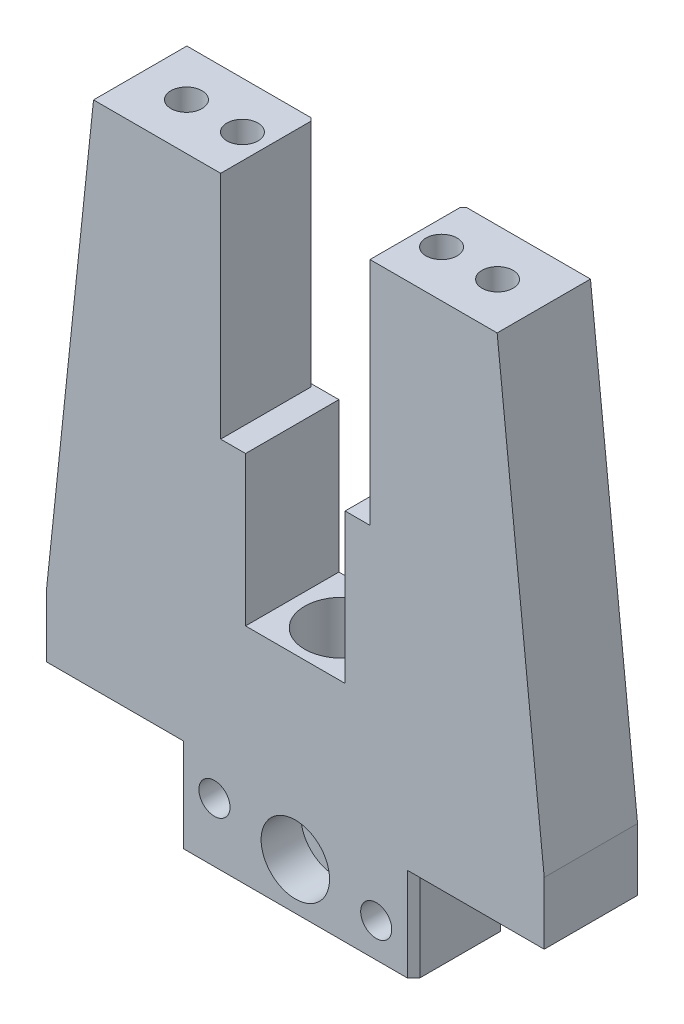
ISO-10303-21;
HEADER;
FILE_DESCRIPTION(('STEP AP214'),'2;1');
FILE_NAME('part.step','',(''),(''),'','','');
FILE_SCHEMA(('AUTOMOTIVE_DESIGN { 1 0 10303 214 1 1 1 1 }'));
ENDSEC;
DATA;
#1=APPLICATION_CONTEXT('core data for automotive mechanical design processes');
#2=APPLICATION_PROTOCOL_DEFINITION('international standard','automotive_design',2000,#1);
#3=PRODUCT_CONTEXT('',#1,'mechanical');
#4=PRODUCT('Part','Part','',(#3));
#5=PRODUCT_RELATED_PRODUCT_CATEGORY('part','',(#4));
#6=PRODUCT_DEFINITION_FORMATION('','',#4);
#7=PRODUCT_DEFINITION_CONTEXT('part definition',#1,'design');
#8=PRODUCT_DEFINITION('design','',#6,#7);
#9=PRODUCT_DEFINITION_SHAPE('','',#8);
#10=(LENGTH_UNIT() NAMED_UNIT(*) SI_UNIT(.MILLI.,.METRE.));
#11=(NAMED_UNIT(*) PLANE_ANGLE_UNIT() SI_UNIT($,.RADIAN.));
#12=(NAMED_UNIT(*) SI_UNIT($,.STERADIAN.) SOLID_ANGLE_UNIT());
#13=UNCERTAINTY_MEASURE_WITH_UNIT(LENGTH_MEASURE(1.E-05),#10,'distance_accuracy_value','');
#14=(GEOMETRIC_REPRESENTATION_CONTEXT(3) GLOBAL_UNCERTAINTY_ASSIGNED_CONTEXT((#13)) GLOBAL_UNIT_ASSIGNED_CONTEXT((#10,
#11,#12)) REPRESENTATION_CONTEXT('',''));
#15=CARTESIAN_POINT('',(0.,0.,0.));
#16=DIRECTION('',(0.,0.,1.));
#17=DIRECTION('',(1.,0.,0.));
#18=AXIS2_PLACEMENT_3D('',#15,#16,#17);
#19=CARTESIAN_POINT('',(-40.,25.,15.));
#20=DIRECTION('',(0.994521895368273,-0.104528463267654,0.));
#21=DIRECTION('',(0.104528463267654,0.994521895368273,0.));
#22=AXIS2_PLACEMENT_3D('',#19,#20,#21);
#23=PLANE('',#22);
#24=DIRECTION('',(-0.104528463267654,-0.994521895368273,0.));
#25=VECTOR('',#24,1.);
#26=CARTESIAN_POINT('',(-40.,25.,0.));
#27=LINE('',#26,#25);
#28=CARTESIAN_POINT('',(-32.4324950608713,97.,0.));
#29=VERTEX_POINT('',#28);
#30=CARTESIAN_POINT('',(-40.,25.,0.));
#31=VERTEX_POINT('',#30);
#32=EDGE_CURVE('E244',#29,#31,#27,.T.);
#33=ORIENTED_EDGE('',*,*,#32,.T.);
#34=DIRECTION('',(0.,0.,-1.));
#35=VECTOR('',#34,1.);
#36=CARTESIAN_POINT('',(-40.,25.,15.));
#37=LINE('',#36,#35);
#38=CARTESIAN_POINT('',(-40.,25.,15.));
#39=VERTEX_POINT('',#38);
#40=EDGE_CURVE('E359',#39,#31,#37,.T.);
#41=ORIENTED_EDGE('',*,*,#40,.F.);
#42=DIRECTION('',(-0.104528463267654,-0.994521895368273,0.));
#43=VECTOR('',#42,1.);
#44=CARTESIAN_POINT('',(-40.,25.,15.));
#45=LINE('',#44,#43);
#46=CARTESIAN_POINT('',(-32.4324950608713,97.,15.));
#47=VERTEX_POINT('',#46);
#48=EDGE_CURVE('E245',#47,#39,#45,.T.);
#49=ORIENTED_EDGE('',*,*,#48,.F.);
#50=DIRECTION('',(0.,0.,-1.));
#51=VECTOR('',#50,1.);
#52=CARTESIAN_POINT('',(-32.4324950608713,97.,15.));
#53=LINE('',#52,#51);
#54=EDGE_CURVE('E280',#47,#29,#53,.T.);
#55=ORIENTED_EDGE('',*,*,#54,.T.);
#56=EDGE_LOOP('',(#33,#41,#49,#55));
#57=FACE_BOUND('',#56,.T.);
#58=ADVANCED_FACE('F38',(#57),#23,.F.);
#59=CARTESIAN_POINT('',(-40.,15.,15.));
#60=DIRECTION('',(1.,0.,0.));
#61=DIRECTION('',(0.,0.,-1.));
#62=AXIS2_PLACEMENT_3D('',#59,#60,#61);
#63=PLANE('',#62);
#64=DIRECTION('',(0.,-1.,0.));
#65=VECTOR('',#64,1.);
#66=CARTESIAN_POINT('',(-40.,15.,0.));
#67=LINE('',#66,#65);
#68=CARTESIAN_POINT('',(-40.,15.,0.));
#69=VERTEX_POINT('',#68);
#70=EDGE_CURVE('E283',#31,#69,#67,.T.);
#71=ORIENTED_EDGE('',*,*,#70,.T.);
#72=DIRECTION('',(0.,0.,-1.));
#73=VECTOR('',#72,1.);
#74=CARTESIAN_POINT('',(-40.,15.,15.));
#75=LINE('',#74,#73);
#76=CARTESIAN_POINT('',(-40.,15.,15.));
#77=VERTEX_POINT('',#76);
#78=EDGE_CURVE('E356',#77,#69,#75,.T.);
#79=ORIENTED_EDGE('',*,*,#78,.F.);
#80=DIRECTION('',(0.,-1.,0.));
#81=VECTOR('',#80,1.);
#82=CARTESIAN_POINT('',(-40.,15.,15.));
#83=LINE('',#82,#81);
#84=EDGE_CURVE('E248',#39,#77,#83,.T.);
#85=ORIENTED_EDGE('',*,*,#84,.F.);
#86=ORIENTED_EDGE('',*,*,#40,.T.);
#87=EDGE_LOOP('',(#71,#79,#85,#86));
#88=FACE_BOUND('',#87,.T.);
#89=ADVANCED_FACE('F514',(#88),#63,.F.);
#90=CARTESIAN_POINT('',(-19.,15.,15.));
#91=DIRECTION('',(0.,1.,0.));
#92=DIRECTION('',(-1.,0.,0.));
#93=AXIS2_PLACEMENT_3D('',#90,#91,#92);
#94=PLANE('',#93);
#95=DIRECTION('',(1.,0.,0.));
#96=VECTOR('',#95,1.);
#97=CARTESIAN_POINT('',(-19.,15.,0.));
#98=LINE('',#97,#96);
#99=CARTESIAN_POINT('',(-18.,15.,0.));
#100=VERTEX_POINT('',#99);
#101=EDGE_CURVE('E285',#69,#100,#98,.T.);
#102=ORIENTED_EDGE('',*,*,#101,.T.);
#103=DIRECTION('',(-0.707106781186543,0.,0.707106781186552));
#104=VECTOR('',#103,1.);
#105=CARTESIAN_POINT('',(-26.,15.,8.0000000000001));
#106=LINE('',#105,#104);
#107=CARTESIAN_POINT('',(-19.,15.,1.));
#108=VERTEX_POINT('',#107);
#109=EDGE_CURVE('E394',#100,#108,#106,.T.);
#110=ORIENTED_EDGE('',*,*,#109,.T.);
#111=DIRECTION('',(0.,0.,-1.));
#112=VECTOR('',#111,1.);
#113=CARTESIAN_POINT('',(-19.,15.,15.));
#114=LINE('',#113,#112);
#115=CARTESIAN_POINT('',(-19.,15.,14.));
#116=VERTEX_POINT('',#115);
#117=EDGE_CURVE('E353',#116,#108,#114,.T.);
#118=ORIENTED_EDGE('',*,*,#117,.F.);
#119=DIRECTION('',(-0.707106781186552,0.,-0.707106781186543));
#120=VECTOR('',#119,1.);
#121=CARTESIAN_POINT('',(-18.5,15.,14.5));
#122=LINE('',#121,#120);
#123=CARTESIAN_POINT('',(-18.,15.,15.));
#124=VERTEX_POINT('',#123);
#125=EDGE_CURVE('E398',#116,#124,#122,.F.);
#126=ORIENTED_EDGE('',*,*,#125,.T.);
#127=DIRECTION('',(1.,0.,0.));
#128=VECTOR('',#127,1.);
#129=CARTESIAN_POINT('',(-19.,15.,15.));
#130=LINE('',#129,#128);
#131=EDGE_CURVE('E251',#77,#124,#130,.T.);
#132=ORIENTED_EDGE('',*,*,#131,.F.);
#133=ORIENTED_EDGE('',*,*,#78,.T.);
#134=EDGE_LOOP('',(#102,#110,#118,#126,#132,#133));
#135=FACE_BOUND('',#134,.T.);
#136=ADVANCED_FACE('F468',(#135),#94,.F.);
#137=CARTESIAN_POINT('',(-19.,0.,15.));
#138=DIRECTION('',(1.,0.,0.));
#139=DIRECTION('',(0.,0.,-1.));
#140=AXIS2_PLACEMENT_3D('',#137,#138,#139);
#141=PLANE('',#140);
#142=ORIENTED_EDGE('',*,*,#117,.T.);
#143=DIRECTION('',(0.,-1.,0.));
#144=VECTOR('',#143,1.);
#145=CARTESIAN_POINT('',(-19.,0.,1.));
#146=LINE('',#145,#144);
#147=CARTESIAN_POINT('',(-19.,0.,1.));
#148=VERTEX_POINT('',#147);
#149=EDGE_CURVE('E382',#108,#148,#146,.T.);
#150=ORIENTED_EDGE('',*,*,#149,.T.);
#151=DIRECTION('',(0.,0.,-1.));
#152=VECTOR('',#151,1.);
#153=CARTESIAN_POINT('',(-19.,0.,15.));
#154=LINE('',#153,#152);
#155=CARTESIAN_POINT('',(-19.,0.,14.));
#156=VERTEX_POINT('',#155);
#157=EDGE_CURVE('E350',#156,#148,#154,.T.);
#158=ORIENTED_EDGE('',*,*,#157,.F.);
#159=DIRECTION('',(0.,1.,0.));
#160=VECTOR('',#159,1.);
#161=CARTESIAN_POINT('',(-19.,0.,14.));
#162=LINE('',#161,#160);
#163=EDGE_CURVE('E380',#156,#116,#162,.T.);
#164=ORIENTED_EDGE('',*,*,#163,.T.);
#165=EDGE_LOOP('',(#142,#150,#158,#164));
#166=FACE_BOUND('',#165,.T.);
#167=ADVANCED_FACE('F463',(#166),#141,.F.);
#168=CARTESIAN_POINT('',(19.,0.,15.));
#169=DIRECTION('',(0.,1.,0.));
#170=DIRECTION('',(0.,0.,1.));
#171=AXIS2_PLACEMENT_3D('',#168,#169,#170);
#172=PLANE('',#171);
#173=DIRECTION('',(1.,0.,0.));
#174=VECTOR('',#173,1.);
#175=CARTESIAN_POINT('',(19.,0.,0.));
#176=LINE('',#175,#174);
#177=CARTESIAN_POINT('',(-18.,0.,0.));
#178=VERTEX_POINT('',#177);
#179=CARTESIAN_POINT('',(18.,0.,0.));
#180=VERTEX_POINT('',#179);
#181=EDGE_CURVE('E287',#178,#180,#176,.T.);
#182=ORIENTED_EDGE('',*,*,#181,.T.);
#183=DIRECTION('',(0.707106781186543,0.,0.707106781186552));
#184=VECTOR('',#183,1.);
#185=CARTESIAN_POINT('',(19.,0.,1.));
#186=LINE('',#185,#184);
#187=CARTESIAN_POINT('',(19.,0.,1.));
#188=VERTEX_POINT('',#187);
#189=EDGE_CURVE('E378',#180,#188,#186,.T.);
#190=ORIENTED_EDGE('',*,*,#189,.T.);
#191=DIRECTION('',(0.,0.,-1.));
#192=VECTOR('',#191,1.);
#193=CARTESIAN_POINT('',(19.,0.,15.));
#194=LINE('',#193,#192);
#195=CARTESIAN_POINT('',(19.,0.,14.));
#196=VERTEX_POINT('',#195);
#197=EDGE_CURVE('E347',#196,#188,#194,.T.);
#198=ORIENTED_EDGE('',*,*,#197,.F.);
#199=DIRECTION('',(0.707106781186552,0.,-0.707106781186543));
#200=VECTOR('',#199,1.);
#201=CARTESIAN_POINT('',(18.,0.,15.));
#202=LINE('',#201,#200);
#203=CARTESIAN_POINT('',(18.,0.,15.));
#204=VERTEX_POINT('',#203);
#205=EDGE_CURVE('E374',#196,#204,#202,.F.);
#206=ORIENTED_EDGE('',*,*,#205,.T.);
#207=DIRECTION('',(1.,0.,0.));
#208=VECTOR('',#207,1.);
#209=CARTESIAN_POINT('',(19.,0.,15.));
#210=LINE('',#209,#208);
#211=CARTESIAN_POINT('',(-18.,0.,15.));
#212=VERTEX_POINT('',#211);
#213=EDGE_CURVE('E253',#212,#204,#210,.T.);
#214=ORIENTED_EDGE('',*,*,#213,.F.);
#215=DIRECTION('',(0.707106781186552,0.,0.707106781186543));
#216=VECTOR('',#215,1.);
#217=CARTESIAN_POINT('',(-18.,0.,15.));
#218=LINE('',#217,#216);
#219=EDGE_CURVE('E372',#212,#156,#218,.F.);
#220=ORIENTED_EDGE('',*,*,#219,.T.);
#221=ORIENTED_EDGE('',*,*,#157,.T.);
#222=DIRECTION('',(0.707106781186543,0.,-0.707106781186552));
#223=VECTOR('',#222,1.);
#224=CARTESIAN_POINT('',(-19.,0.,1.));
#225=LINE('',#224,#223);
#226=EDGE_CURVE('E376',#148,#178,#225,.T.);
#227=ORIENTED_EDGE('',*,*,#226,.T.);
#228=EDGE_LOOP('',(#182,#190,#198,#206,#214,#220,#221,#227));
#229=FACE_BOUND('',#228,.T.);
#230=ADVANCED_FACE('F455',(#229),#172,.F.);
#231=CARTESIAN_POINT('',(19.,0.,15.));
#232=DIRECTION('',(-1.,0.,0.));
#233=DIRECTION('',(0.,0.,1.));
#234=AXIS2_PLACEMENT_3D('',#231,#232,#233);
#235=PLANE('',#234);
#236=ORIENTED_EDGE('',*,*,#197,.T.);
#237=DIRECTION('',(0.,1.,0.));
#238=VECTOR('',#237,1.);
#239=CARTESIAN_POINT('',(19.,15.,1.));
#240=LINE('',#239,#238);
#241=CARTESIAN_POINT('',(19.,15.,1.));
#242=VERTEX_POINT('',#241);
#243=EDGE_CURVE('E364',#188,#242,#240,.T.);
#244=ORIENTED_EDGE('',*,*,#243,.T.);
#245=DIRECTION('',(0.,0.,-1.));
#246=VECTOR('',#245,1.);
#247=CARTESIAN_POINT('',(19.,15.,15.));
#248=LINE('',#247,#246);
#249=CARTESIAN_POINT('',(19.,15.,14.));
#250=VERTEX_POINT('',#249);
#251=EDGE_CURVE('E344',#250,#242,#248,.T.);
#252=ORIENTED_EDGE('',*,*,#251,.F.);
#253=DIRECTION('',(0.,-1.,0.));
#254=VECTOR('',#253,1.);
#255=CARTESIAN_POINT('',(19.,0.,14.));
#256=LINE('',#255,#254);
#257=EDGE_CURVE('E362',#250,#196,#256,.T.);
#258=ORIENTED_EDGE('',*,*,#257,.T.);
#259=EDGE_LOOP('',(#236,#244,#252,#258));
#260=FACE_BOUND('',#259,.T.);
#261=ADVANCED_FACE('F640',(#260),#235,.F.);
#262=CARTESIAN_POINT('',(19.,15.,15.));
#263=DIRECTION('',(0.,1.,0.));
#264=DIRECTION('',(-1.,0.,0.));
#265=AXIS2_PLACEMENT_3D('',#262,#263,#264);
#266=PLANE('',#265);
#267=DIRECTION('',(1.,0.,0.));
#268=VECTOR('',#267,1.);
#269=CARTESIAN_POINT('',(19.,15.,0.));
#270=LINE('',#269,#268);
#271=CARTESIAN_POINT('',(18.,15.,0.));
#272=VERTEX_POINT('',#271);
#273=CARTESIAN_POINT('',(40.,15.,0.));
#274=VERTEX_POINT('',#273);
#275=EDGE_CURVE('E290',#272,#274,#270,.T.);
#276=ORIENTED_EDGE('',*,*,#275,.T.);
#277=DIRECTION('',(0.,0.,-1.));
#278=VECTOR('',#277,1.);
#279=CARTESIAN_POINT('',(40.,15.,15.));
#280=LINE('',#279,#278);
#281=CARTESIAN_POINT('',(40.,15.,15.));
#282=VERTEX_POINT('',#281);
#283=EDGE_CURVE('E341',#282,#274,#280,.T.);
#284=ORIENTED_EDGE('',*,*,#283,.F.);
#285=DIRECTION('',(1.,0.,0.));
#286=VECTOR('',#285,1.);
#287=CARTESIAN_POINT('',(19.,15.,15.));
#288=LINE('',#287,#286);
#289=CARTESIAN_POINT('',(18.,15.,15.));
#290=VERTEX_POINT('',#289);
#291=EDGE_CURVE('E256',#290,#282,#288,.T.);
#292=ORIENTED_EDGE('',*,*,#291,.F.);
#293=DIRECTION('',(-0.707106781186552,0.,0.707106781186543));
#294=VECTOR('',#293,1.);
#295=CARTESIAN_POINT('',(18.5,15.,14.5));
#296=LINE('',#295,#294);
#297=EDGE_CURVE('E396',#290,#250,#296,.F.);
#298=ORIENTED_EDGE('',*,*,#297,.T.);
#299=ORIENTED_EDGE('',*,*,#251,.T.);
#300=DIRECTION('',(-0.707106781186543,0.,-0.707106781186552));
#301=VECTOR('',#300,1.);
#302=CARTESIAN_POINT('',(26.,15.,8.0000000000001));
#303=LINE('',#302,#301);
#304=EDGE_CURVE('E391',#242,#272,#303,.T.);
#305=ORIENTED_EDGE('',*,*,#304,.T.);
#306=EDGE_LOOP('',(#276,#284,#292,#298,#299,#305));
#307=FACE_BOUND('',#306,.T.);
#308=ADVANCED_FACE('F444',(#307),#266,.F.);
#309=CARTESIAN_POINT('',(40.,15.,15.));
#310=DIRECTION('',(-1.,0.,0.));
#311=DIRECTION('',(0.,0.,1.));
#312=AXIS2_PLACEMENT_3D('',#309,#310,#311);
#313=PLANE('',#312);
#314=DIRECTION('',(0.,1.,0.));
#315=VECTOR('',#314,1.);
#316=CARTESIAN_POINT('',(40.,15.,0.));
#317=LINE('',#316,#315);
#318=CARTESIAN_POINT('',(40.,25.,0.));
#319=VERTEX_POINT('',#318);
#320=EDGE_CURVE('E292',#274,#319,#317,.T.);
#321=ORIENTED_EDGE('',*,*,#320,.T.);
#322=DIRECTION('',(0.,0.,-1.));
#323=VECTOR('',#322,1.);
#324=CARTESIAN_POINT('',(40.,25.,15.));
#325=LINE('',#324,#323);
#326=CARTESIAN_POINT('',(40.,25.,15.));
#327=VERTEX_POINT('',#326);
#328=EDGE_CURVE('E338',#327,#319,#325,.T.);
#329=ORIENTED_EDGE('',*,*,#328,.F.);
#330=DIRECTION('',(0.,1.,0.));
#331=VECTOR('',#330,1.);
#332=CARTESIAN_POINT('',(40.,15.,15.));
#333=LINE('',#332,#331);
#334=EDGE_CURVE('E258',#282,#327,#333,.T.);
#335=ORIENTED_EDGE('',*,*,#334,.F.);
#336=ORIENTED_EDGE('',*,*,#283,.T.);
#337=EDGE_LOOP('',(#321,#329,#335,#336));
#338=FACE_BOUND('',#337,.T.);
#339=ADVANCED_FACE('F440',(#338),#313,.F.);
#340=CARTESIAN_POINT('',(40.,25.,15.));
#341=DIRECTION('',(-0.994521895368273,-0.104528463267654,0.));
#342=DIRECTION('',(0.104528463267654,-0.994521895368273,0.));
#343=AXIS2_PLACEMENT_3D('',#340,#341,#342);
#344=PLANE('',#343);
#345=DIRECTION('',(-0.104528463267654,0.994521895368273,0.));
#346=VECTOR('',#345,1.);
#347=CARTESIAN_POINT('',(40.,25.,0.));
#348=LINE('',#347,#346);
#349=CARTESIAN_POINT('',(32.4324950608713,97.,0.));
#350=VERTEX_POINT('',#349);
#351=EDGE_CURVE('E294',#319,#350,#348,.T.);
#352=ORIENTED_EDGE('',*,*,#351,.T.);
#353=DIRECTION('',(0.,0.,-1.));
#354=VECTOR('',#353,1.);
#355=CARTESIAN_POINT('',(32.4324950608713,97.,15.));
#356=LINE('',#355,#354);
#357=CARTESIAN_POINT('',(32.4324950608713,97.,15.));
#358=VERTEX_POINT('',#357);
#359=EDGE_CURVE('E335',#358,#350,#356,.T.);
#360=ORIENTED_EDGE('',*,*,#359,.F.);
#361=DIRECTION('',(-0.104528463267654,0.994521895368273,0.));
#362=VECTOR('',#361,1.);
#363=CARTESIAN_POINT('',(40.,25.,15.));
#364=LINE('',#363,#362);
#365=EDGE_CURVE('E260',#327,#358,#364,.T.);
#366=ORIENTED_EDGE('',*,*,#365,.F.);
#367=ORIENTED_EDGE('',*,*,#328,.T.);
#368=EDGE_LOOP('',(#352,#360,#366,#367));
#369=FACE_BOUND('',#368,.T.);
#370=ADVANCED_FACE('F436',(#369),#344,.F.);
#371=CARTESIAN_POINT('',(32.4324950608713,97.,15.));
#372=DIRECTION('',(0.,-1.,0.));
#373=DIRECTION('',(0.,0.,-1.));
#374=AXIS2_PLACEMENT_3D('',#371,#372,#373);
#375=PLANE('',#374);
#376=CARTESIAN_POINT('',(25.,97.,7.5));
#377=DIRECTION('',(0.,1.,0.));
#378=DIRECTION('',(0.,0.,1.));
#379=AXIS2_PLACEMENT_3D('',#376,#377,#378);
#380=CIRCLE('',#379,2.5);
#381=CARTESIAN_POINT('',(25.,97.,10.));
#382=VERTEX_POINT('',#381);
#383=EDGE_CURVE('E219',#382,#382,#380,.T.);
#384=ORIENTED_EDGE('',*,*,#383,.F.);
#385=EDGE_LOOP('',(#384));
#386=FACE_BOUND('',#385,.T.);
#387=CARTESIAN_POINT('',(16.,97.,7.5));
#388=DIRECTION('',(0.,1.,0.));
#389=DIRECTION('',(0.,0.,1.));
#390=AXIS2_PLACEMENT_3D('',#387,#388,#389);
#391=CIRCLE('',#390,2.49999999999999);
#392=CARTESIAN_POINT('',(16.,97.,9.99999999999999));
#393=VERTEX_POINT('',#392);
#394=EDGE_CURVE('E238',#393,#393,#391,.T.);
#395=ORIENTED_EDGE('',*,*,#394,.F.);
#396=EDGE_LOOP('',(#395));
#397=FACE_BOUND('',#396,.T.);
#398=DIRECTION('',(-1.,0.,0.));
#399=VECTOR('',#398,1.);
#400=CARTESIAN_POINT('',(32.4324950608713,97.,0.));
#401=LINE('',#400,#399);
#402=CARTESIAN_POINT('',(12.5,97.,0.));
#403=VERTEX_POINT('',#402);
#404=EDGE_CURVE('E296',#350,#403,#401,.T.);
#405=ORIENTED_EDGE('',*,*,#404,.T.);
#406=DIRECTION('',(-0.707106781186536,0.,0.707106781186559));
#407=VECTOR('',#406,1.);
#408=CARTESIAN_POINT('',(12.,97.,0.5));
#409=LINE('',#408,#407);
#410=CARTESIAN_POINT('',(12.,97.,0.500000000000004));
#411=VERTEX_POINT('',#410);
#412=EDGE_CURVE('E409',#403,#411,#409,.T.);
#413=ORIENTED_EDGE('',*,*,#412,.T.);
#414=DIRECTION('',(0.,0.,-1.));
#415=VECTOR('',#414,1.);
#416=CARTESIAN_POINT('',(12.,97.,15.));
#417=LINE('',#416,#415);
#418=CARTESIAN_POINT('',(12.,97.,15.));
#419=VERTEX_POINT('',#418);
#420=EDGE_CURVE('E332',#419,#411,#417,.T.);
#421=ORIENTED_EDGE('',*,*,#420,.F.);
#422=DIRECTION('',(-1.,0.,0.));
#423=VECTOR('',#422,1.);
#424=CARTESIAN_POINT('',(32.4324950608713,97.,15.));
#425=LINE('',#424,#423);
#426=EDGE_CURVE('E262',#358,#419,#425,.T.);
#427=ORIENTED_EDGE('',*,*,#426,.F.);
#428=ORIENTED_EDGE('',*,*,#359,.T.);
#429=EDGE_LOOP('',(#405,#413,#421,#427,#428));
#430=FACE_BOUND('',#429,.T.);
#431=ADVANCED_FACE('F430',(#386,#397,#430),#375,.F.);
#432=CARTESIAN_POINT('',(12.,97.,15.));
#433=DIRECTION('',(1.,0.,0.));
#434=DIRECTION('',(0.,1.,0.));
#435=AXIS2_PLACEMENT_3D('',#432,#433,#434);
#436=PLANE('',#435);
#437=ORIENTED_EDGE('',*,*,#420,.T.);
#438=DIRECTION('',(0.,-1.,0.));
#439=VECTOR('',#438,1.);
#440=CARTESIAN_POINT('',(12.,60.,0.5));
#441=LINE('',#440,#439);
#442=CARTESIAN_POINT('',(12.,60.,0.5));
#443=VERTEX_POINT('',#442);
#444=EDGE_CURVE('E401',#411,#443,#441,.T.);
#445=ORIENTED_EDGE('',*,*,#444,.T.);
#446=DIRECTION('',(0.,0.,-1.));
#447=VECTOR('',#446,1.);
#448=CARTESIAN_POINT('',(12.,60.,15.));
#449=LINE('',#448,#447);
#450=CARTESIAN_POINT('',(12.,60.,15.));
#451=VERTEX_POINT('',#450);
#452=EDGE_CURVE('E329',#451,#443,#449,.T.);
#453=ORIENTED_EDGE('',*,*,#452,.F.);
#454=DIRECTION('',(0.,-1.,0.));
#455=VECTOR('',#454,1.);
#456=CARTESIAN_POINT('',(12.,97.,15.));
#457=LINE('',#456,#455);
#458=EDGE_CURVE('E264',#419,#451,#457,.T.);
#459=ORIENTED_EDGE('',*,*,#458,.F.);
#460=EDGE_LOOP('',(#437,#445,#453,#459));
#461=FACE_BOUND('',#460,.T.);
#462=ADVANCED_FACE('F483',(#461),#436,.F.);
#463=CARTESIAN_POINT('',(12.,60.,15.));
#464=DIRECTION('',(0.,-1.,0.));
#465=DIRECTION('',(0.,0.,-1.));
#466=AXIS2_PLACEMENT_3D('',#463,#464,#465);
#467=PLANE('',#466);
#468=DIRECTION('',(-1.,0.,0.));
#469=VECTOR('',#468,1.);
#470=CARTESIAN_POINT('',(12.,60.,0.));
#471=LINE('',#470,#469);
#472=CARTESIAN_POINT('',(12.5,60.,0.));
#473=VERTEX_POINT('',#472);
#474=CARTESIAN_POINT('',(8.,60.,0.));
#475=VERTEX_POINT('',#474);
#476=EDGE_CURVE('E299',#473,#475,#471,.T.);
#477=ORIENTED_EDGE('',*,*,#476,.T.);
#478=DIRECTION('',(0.,0.,-1.));
#479=VECTOR('',#478,1.);
#480=CARTESIAN_POINT('',(8.,60.,15.));
#481=LINE('',#480,#479);
#482=CARTESIAN_POINT('',(8.,60.,15.));
#483=VERTEX_POINT('',#482);
#484=EDGE_CURVE('E326',#483,#475,#481,.T.);
#485=ORIENTED_EDGE('',*,*,#484,.F.);
#486=DIRECTION('',(-1.,0.,0.));
#487=VECTOR('',#486,1.);
#488=CARTESIAN_POINT('',(12.,60.,15.));
#489=LINE('',#488,#487);
#490=EDGE_CURVE('E266',#451,#483,#489,.T.);
#491=ORIENTED_EDGE('',*,*,#490,.F.);
#492=ORIENTED_EDGE('',*,*,#452,.T.);
#493=DIRECTION('',(0.707106781186536,0.,-0.707106781186559));
#494=VECTOR('',#493,1.);
#495=CARTESIAN_POINT('',(4.75,60.,7.75000000000023));
#496=LINE('',#495,#494);
#497=EDGE_CURVE('E46',#443,#473,#496,.T.);
#498=ORIENTED_EDGE('',*,*,#497,.T.);
#499=EDGE_LOOP('',(#477,#485,#491,#492,#498));
#500=FACE_BOUND('',#499,.T.);
#501=ADVANCED_FACE('F416',(#500),#467,.F.);
#502=CARTESIAN_POINT('',(8.,60.,15.));
#503=DIRECTION('',(1.,0.,0.));
#504=DIRECTION('',(0.,1.,0.));
#505=AXIS2_PLACEMENT_3D('',#502,#503,#504);
#506=PLANE('',#505);
#507=DIRECTION('',(0.,-1.,0.));
#508=VECTOR('',#507,1.);
#509=CARTESIAN_POINT('',(8.,60.,0.));
#510=LINE('',#509,#508);
#511=CARTESIAN_POINT('',(8.,36.,0.));
#512=VERTEX_POINT('',#511);
#513=EDGE_CURVE('E301',#475,#512,#510,.T.);
#514=ORIENTED_EDGE('',*,*,#513,.T.);
#515=DIRECTION('',(0.,0.,-1.));
#516=VECTOR('',#515,1.);
#517=CARTESIAN_POINT('',(8.,36.,15.));
#518=LINE('',#517,#516);
#519=CARTESIAN_POINT('',(8.,36.,15.));
#520=VERTEX_POINT('',#519);
#521=EDGE_CURVE('E323',#520,#512,#518,.T.);
#522=ORIENTED_EDGE('',*,*,#521,.F.);
#523=DIRECTION('',(0.,-1.,0.));
#524=VECTOR('',#523,1.);
#525=CARTESIAN_POINT('',(8.,60.,15.));
#526=LINE('',#525,#524);
#527=EDGE_CURVE('E268',#483,#520,#526,.T.);
#528=ORIENTED_EDGE('',*,*,#527,.F.);
#529=ORIENTED_EDGE('',*,*,#484,.T.);
#530=EDGE_LOOP('',(#514,#522,#528,#529));
#531=FACE_BOUND('',#530,.T.);
#532=ADVANCED_FACE('F489',(#531),#506,.F.);
#533=CARTESIAN_POINT('',(-8.,36.,15.));
#534=DIRECTION('',(0.,-1.,0.));
#535=DIRECTION('',(0.,0.,-1.));
#536=AXIS2_PLACEMENT_3D('',#533,#534,#535);
#537=PLANE('',#536);
#538=CARTESIAN_POINT('',(0.,36.,7.5));
#539=DIRECTION('',(0.,1.,0.));
#540=DIRECTION('',(0.,0.,1.));
#541=AXIS2_PLACEMENT_3D('',#538,#539,#540);
#542=CIRCLE('',#541,6.);
#543=CARTESIAN_POINT('',(0.,36.,13.5));
#544=VERTEX_POINT('',#543);
#545=EDGE_CURVE('E869',#544,#544,#542,.T.);
#546=ORIENTED_EDGE('',*,*,#545,.F.);
#547=EDGE_LOOP('',(#546));
#548=FACE_BOUND('',#547,.T.);
#549=DIRECTION('',(-1.,0.,0.));
#550=VECTOR('',#549,1.);
#551=CARTESIAN_POINT('',(-8.,36.,0.));
#552=LINE('',#551,#550);
#553=CARTESIAN_POINT('',(-8.,36.,0.));
#554=VERTEX_POINT('',#553);
#555=EDGE_CURVE('E303',#512,#554,#552,.T.);
#556=ORIENTED_EDGE('',*,*,#555,.T.);
#557=DIRECTION('',(0.,0.,-1.));
#558=VECTOR('',#557,1.);
#559=CARTESIAN_POINT('',(-8.,36.,15.));
#560=LINE('',#559,#558);
#561=CARTESIAN_POINT('',(-8.,36.,15.));
#562=VERTEX_POINT('',#561);
#563=EDGE_CURVE('E320',#562,#554,#560,.T.);
#564=ORIENTED_EDGE('',*,*,#563,.F.);
#565=DIRECTION('',(-1.,0.,0.));
#566=VECTOR('',#565,1.);
#567=CARTESIAN_POINT('',(-8.,36.,15.));
#568=LINE('',#567,#566);
#569=EDGE_CURVE('E270',#520,#562,#568,.T.);
#570=ORIENTED_EDGE('',*,*,#569,.F.);
#571=ORIENTED_EDGE('',*,*,#521,.T.);
#572=EDGE_LOOP('',(#556,#564,#570,#571));
#573=FACE_BOUND('',#572,.T.);
#574=ADVANCED_FACE('F492',(#548,#573),#537,.F.);
#575=CARTESIAN_POINT('',(-8.,60.,15.));
#576=DIRECTION('',(-1.,0.,0.));
#577=DIRECTION('',(0.,-1.,0.));
#578=AXIS2_PLACEMENT_3D('',#575,#576,#577);
#579=PLANE('',#578);
#580=DIRECTION('',(0.,1.,0.));
#581=VECTOR('',#580,1.);
#582=CARTESIAN_POINT('',(-8.,60.,0.));
#583=LINE('',#582,#581);
#584=CARTESIAN_POINT('',(-8.,60.,0.));
#585=VERTEX_POINT('',#584);
#586=EDGE_CURVE('E305',#554,#585,#583,.T.);
#587=ORIENTED_EDGE('',*,*,#586,.T.);
#588=DIRECTION('',(0.,0.,-1.));
#589=VECTOR('',#588,1.);
#590=CARTESIAN_POINT('',(-8.,60.,15.));
#591=LINE('',#590,#589);
#592=CARTESIAN_POINT('',(-8.,60.,15.));
#593=VERTEX_POINT('',#592);
#594=EDGE_CURVE('E317',#593,#585,#591,.T.);
#595=ORIENTED_EDGE('',*,*,#594,.F.);
#596=DIRECTION('',(0.,1.,0.));
#597=VECTOR('',#596,1.);
#598=CARTESIAN_POINT('',(-8.,60.,15.));
#599=LINE('',#598,#597);
#600=EDGE_CURVE('E272',#562,#593,#599,.T.);
#601=ORIENTED_EDGE('',*,*,#600,.F.);
#602=ORIENTED_EDGE('',*,*,#563,.T.);
#603=EDGE_LOOP('',(#587,#595,#601,#602));
#604=FACE_BOUND('',#603,.T.);
#605=ADVANCED_FACE('F497',(#604),#579,.F.);
#606=CARTESIAN_POINT('',(-12.,60.,15.));
#607=DIRECTION('',(0.,-1.,0.));
#608=DIRECTION('',(0.,0.,-1.));
#609=AXIS2_PLACEMENT_3D('',#606,#607,#608);
#610=PLANE('',#609);
#611=DIRECTION('',(-1.,0.,0.));
#612=VECTOR('',#611,1.);
#613=CARTESIAN_POINT('',(-12.,60.,0.));
#614=LINE('',#613,#612);
#615=CARTESIAN_POINT('',(-12.5,60.,0.));
#616=VERTEX_POINT('',#615);
#617=EDGE_CURVE('E307',#585,#616,#614,.T.);
#618=ORIENTED_EDGE('',*,*,#617,.T.);
#619=DIRECTION('',(0.707106781186536,0.,0.707106781186559));
#620=VECTOR('',#619,1.);
#621=CARTESIAN_POINT('',(-4.75,60.,7.75000000000023));
#622=LINE('',#621,#620);
#623=CARTESIAN_POINT('',(-12.,60.,0.5));
#624=VERTEX_POINT('',#623);
#625=EDGE_CURVE('E11',#616,#624,#622,.T.);
#626=ORIENTED_EDGE('',*,*,#625,.T.);
#627=DIRECTION('',(0.,0.,-1.));
#628=VECTOR('',#627,1.);
#629=CARTESIAN_POINT('',(-12.,60.,15.));
#630=LINE('',#629,#628);
#631=CARTESIAN_POINT('',(-12.,60.,15.));
#632=VERTEX_POINT('',#631);
#633=EDGE_CURVE('E315',#632,#624,#630,.T.);
#634=ORIENTED_EDGE('',*,*,#633,.F.);
#635=DIRECTION('',(-1.,0.,0.));
#636=VECTOR('',#635,1.);
#637=CARTESIAN_POINT('',(-12.,60.,15.));
#638=LINE('',#637,#636);
#639=EDGE_CURVE('E274',#593,#632,#638,.T.);
#640=ORIENTED_EDGE('',*,*,#639,.F.);
#641=ORIENTED_EDGE('',*,*,#594,.T.);
#642=EDGE_LOOP('',(#618,#626,#634,#640,#641));
#643=FACE_BOUND('',#642,.T.);
#644=ADVANCED_FACE('F501',(#643),#610,.F.);
#645=CARTESIAN_POINT('',(-12.,97.,15.));
#646=DIRECTION('',(-1.,0.,0.));
#647=DIRECTION('',(0.,-1.,0.));
#648=AXIS2_PLACEMENT_3D('',#645,#646,#647);
#649=PLANE('',#648);
#650=ORIENTED_EDGE('',*,*,#633,.T.);
#651=DIRECTION('',(0.,1.,0.));
#652=VECTOR('',#651,1.);
#653=CARTESIAN_POINT('',(-12.,97.,0.5));
#654=LINE('',#653,#652);
#655=CARTESIAN_POINT('',(-12.,97.,0.500000000000004));
#656=VERTEX_POINT('',#655);
#657=EDGE_CURVE('E411',#624,#656,#654,.T.);
#658=ORIENTED_EDGE('',*,*,#657,.T.);
#659=DIRECTION('',(0.,0.,-1.));
#660=VECTOR('',#659,1.);
#661=CARTESIAN_POINT('',(-12.,97.,15.));
#662=LINE('',#661,#660);
#663=CARTESIAN_POINT('',(-12.,97.,15.));
#664=VERTEX_POINT('',#663);
#665=EDGE_CURVE('E312',#664,#656,#662,.T.);
#666=ORIENTED_EDGE('',*,*,#665,.F.);
#667=DIRECTION('',(0.,1.,0.));
#668=VECTOR('',#667,1.);
#669=CARTESIAN_POINT('',(-12.,97.,15.));
#670=LINE('',#669,#668);
#671=EDGE_CURVE('E276',#632,#664,#670,.T.);
#672=ORIENTED_EDGE('',*,*,#671,.F.);
#673=EDGE_LOOP('',(#650,#658,#666,#672));
#674=FACE_BOUND('',#673,.T.);
#675=ADVANCED_FACE('F503',(#674),#649,.F.);
#676=CARTESIAN_POINT('',(-32.4324950608713,97.,15.));
#677=DIRECTION('',(0.,-1.,0.));
#678=DIRECTION('',(0.,0.,-1.));
#679=AXIS2_PLACEMENT_3D('',#676,#677,#678);
#680=PLANE('',#679);
#681=CARTESIAN_POINT('',(-25.,97.,7.5));
#682=DIRECTION('',(0.,1.,0.));
#683=DIRECTION('',(0.,0.,1.));
#684=AXIS2_PLACEMENT_3D('',#681,#682,#683);
#685=CIRCLE('',#684,2.5);
#686=CARTESIAN_POINT('',(-25.,97.,10.));
#687=VERTEX_POINT('',#686);
#688=EDGE_CURVE('E220',#687,#687,#685,.T.);
#689=ORIENTED_EDGE('',*,*,#688,.F.);
#690=EDGE_LOOP('',(#689));
#691=FACE_BOUND('',#690,.T.);
#692=CARTESIAN_POINT('',(-16.,97.,7.5));
#693=DIRECTION('',(0.,1.,0.));
#694=DIRECTION('',(0.,0.,1.));
#695=AXIS2_PLACEMENT_3D('',#692,#693,#694);
#696=CIRCLE('',#695,2.49999999999999);
#697=CARTESIAN_POINT('',(-16.,97.,9.99999999999999));
#698=VERTEX_POINT('',#697);
#699=EDGE_CURVE('E232',#698,#698,#696,.T.);
#700=ORIENTED_EDGE('',*,*,#699,.F.);
#701=EDGE_LOOP('',(#700));
#702=FACE_BOUND('',#701,.T.);
#703=ORIENTED_EDGE('',*,*,#665,.T.);
#704=DIRECTION('',(-0.707106781186536,0.,-0.707106781186559));
#705=VECTOR('',#704,1.);
#706=CARTESIAN_POINT('',(-12.,97.,0.5));
#707=LINE('',#706,#705);
#708=CARTESIAN_POINT('',(-12.5,97.,0.));
#709=VERTEX_POINT('',#708);
#710=EDGE_CURVE('E59',#656,#709,#707,.T.);
#711=ORIENTED_EDGE('',*,*,#710,.T.);
#712=DIRECTION('',(-1.,0.,0.));
#713=VECTOR('',#712,1.);
#714=CARTESIAN_POINT('',(-32.4324950608713,97.,0.));
#715=LINE('',#714,#713);
#716=EDGE_CURVE('E249',#709,#29,#715,.T.);
#717=ORIENTED_EDGE('',*,*,#716,.T.);
#718=ORIENTED_EDGE('',*,*,#54,.F.);
#719=DIRECTION('',(-1.,0.,0.));
#720=VECTOR('',#719,1.);
#721=CARTESIAN_POINT('',(-32.4324950608713,97.,15.));
#722=LINE('',#721,#720);
#723=EDGE_CURVE('E278',#664,#47,#722,.T.);
#724=ORIENTED_EDGE('',*,*,#723,.F.);
#725=EDGE_LOOP('',(#703,#711,#717,#718,#724));
#726=FACE_BOUND('',#725,.T.);
#727=ADVANCED_FACE('F507',(#691,#702,#726),#680,.F.);
#728=CARTESIAN_POINT('',(0.,0.,15.));
#729=DIRECTION('',(0.,0.,-1.));
#730=DIRECTION('',(-1.,0.,0.));
#731=AXIS2_PLACEMENT_3D('',#728,#729,#730);
#732=PLANE('',#731);
#733=CARTESIAN_POINT('',(0.,7.5,15.));
#734=DIRECTION('',(0.,0.,1.));
#735=DIRECTION('',(1.,0.,0.));
#736=AXIS2_PLACEMENT_3D('',#733,#734,#735);
#737=CIRCLE('',#736,5.49999999999999);
#738=CARTESIAN_POINT('',(5.49999999999999,7.5,15.));
#739=VERTEX_POINT('',#738);
#740=EDGE_CURVE('E861',#739,#739,#737,.T.);
#741=ORIENTED_EDGE('',*,*,#740,.F.);
#742=EDGE_LOOP('',(#741));
#743=FACE_BOUND('',#742,.T.);
#744=CARTESIAN_POINT('',(13.,5.5,15.));
#745=DIRECTION('',(0.,0.,-1.));
#746=DIRECTION('',(-1.,0.,0.));
#747=AXIS2_PLACEMENT_3D('',#744,#745,#746);
#748=CIRCLE('',#747,2.5);
#749=CARTESIAN_POINT('',(10.5,5.5,15.));
#750=VERTEX_POINT('',#749);
#751=EDGE_CURVE('E865',#750,#750,#748,.T.);
#752=ORIENTED_EDGE('',*,*,#751,.T.);
#753=EDGE_LOOP('',(#752));
#754=FACE_BOUND('',#753,.T.);
#755=CARTESIAN_POINT('',(-13.,9.5,15.));
#756=DIRECTION('',(0.,0.,-1.));
#757=DIRECTION('',(-1.,0.,0.));
#758=AXIS2_PLACEMENT_3D('',#755,#756,#757);
#759=CIRCLE('',#758,2.5);
#760=CARTESIAN_POINT('',(-15.5,9.5,15.));
#761=VERTEX_POINT('',#760);
#762=EDGE_CURVE('E868',#761,#761,#759,.T.);
#763=ORIENTED_EDGE('',*,*,#762,.T.);
#764=EDGE_LOOP('',(#763));
#765=FACE_BOUND('',#764,.T.);
#766=ORIENTED_EDGE('',*,*,#213,.T.);
#767=DIRECTION('',(0.,1.,0.));
#768=VECTOR('',#767,1.);
#769=CARTESIAN_POINT('',(18.,0.,15.));
#770=LINE('',#769,#768);
#771=EDGE_CURVE('E388',#204,#290,#770,.T.);
#772=ORIENTED_EDGE('',*,*,#771,.T.);
#773=ORIENTED_EDGE('',*,*,#291,.T.);
#774=ORIENTED_EDGE('',*,*,#334,.T.);
#775=ORIENTED_EDGE('',*,*,#365,.T.);
#776=ORIENTED_EDGE('',*,*,#426,.T.);
#777=ORIENTED_EDGE('',*,*,#458,.T.);
#778=ORIENTED_EDGE('',*,*,#490,.T.);
#779=ORIENTED_EDGE('',*,*,#527,.T.);
#780=ORIENTED_EDGE('',*,*,#569,.T.);
#781=ORIENTED_EDGE('',*,*,#600,.T.);
#782=ORIENTED_EDGE('',*,*,#639,.T.);
#783=ORIENTED_EDGE('',*,*,#671,.T.);
#784=ORIENTED_EDGE('',*,*,#723,.T.);
#785=ORIENTED_EDGE('',*,*,#48,.T.);
#786=ORIENTED_EDGE('',*,*,#84,.T.);
#787=ORIENTED_EDGE('',*,*,#131,.T.);
#788=DIRECTION('',(0.,-1.,0.));
#789=VECTOR('',#788,1.);
#790=CARTESIAN_POINT('',(-18.,0.,15.));
#791=LINE('',#790,#789);
#792=EDGE_CURVE('E385',#124,#212,#791,.T.);
#793=ORIENTED_EDGE('',*,*,#792,.T.);
#794=EDGE_LOOP('',(#766,#772,#773,#774,#775,#776,#777,#778,#779,#780,#781,#782,#783,#784,#785,
#786,#787,#793));
#795=FACE_BOUND('',#794,.T.);
#796=ADVANCED_FACE('F475',(#743,#754,#765,#795),#732,.F.);
#797=CARTESIAN_POINT('',(0.,0.,0.));
#798=DIRECTION('',(0.,0.,-1.));
#799=DIRECTION('',(-1.,0.,0.));
#800=AXIS2_PLACEMENT_3D('',#797,#798,#799);
#801=PLANE('',#800);
#802=CARTESIAN_POINT('',(0.,7.5,0.));
#803=DIRECTION('',(0.,0.,1.));
#804=DIRECTION('',(1.,0.,0.));
#805=AXIS2_PLACEMENT_3D('',#802,#803,#804);
#806=CIRCLE('',#805,3.3);
#807=CARTESIAN_POINT('',(3.3,7.5,0.));
#808=VERTEX_POINT('',#807);
#809=EDGE_CURVE('E885',#808,#808,#806,.T.);
#810=ORIENTED_EDGE('',*,*,#809,.T.);
#811=EDGE_LOOP('',(#810));
#812=FACE_BOUND('',#811,.T.);
#813=CARTESIAN_POINT('',(13.,5.5,0.));
#814=DIRECTION('',(0.,0.,-1.));
#815=DIRECTION('',(-1.,0.,0.));
#816=AXIS2_PLACEMENT_3D('',#813,#814,#815);
#817=CIRCLE('',#816,2.49999999999999);
#818=CARTESIAN_POINT('',(10.5,5.5,0.));
#819=VERTEX_POINT('',#818);
#820=EDGE_CURVE('E882',#819,#819,#817,.T.);
#821=ORIENTED_EDGE('',*,*,#820,.F.);
#822=EDGE_LOOP('',(#821));
#823=FACE_BOUND('',#822,.T.);
#824=CARTESIAN_POINT('',(-13.,9.5,0.));
#825=DIRECTION('',(0.,0.,-1.));
#826=DIRECTION('',(-1.,0.,0.));
#827=AXIS2_PLACEMENT_3D('',#824,#825,#826);
#828=CIRCLE('',#827,2.49999999999999);
#829=CARTESIAN_POINT('',(-15.5,9.5,0.));
#830=VERTEX_POINT('',#829);
#831=EDGE_CURVE('E870',#830,#830,#828,.T.);
#832=ORIENTED_EDGE('',*,*,#831,.F.);
#833=EDGE_LOOP('',(#832));
#834=FACE_BOUND('',#833,.T.);
#835=ORIENTED_EDGE('',*,*,#476,.F.);
#836=DIRECTION('',(0.,1.,0.));
#837=VECTOR('',#836,1.);
#838=CARTESIAN_POINT('',(12.5,97.,0.));
#839=LINE('',#838,#837);
#840=EDGE_CURVE('E407',#473,#403,#839,.T.);
#841=ORIENTED_EDGE('',*,*,#840,.T.);
#842=ORIENTED_EDGE('',*,*,#404,.F.);
#843=ORIENTED_EDGE('',*,*,#351,.F.);
#844=ORIENTED_EDGE('',*,*,#320,.F.);
#845=ORIENTED_EDGE('',*,*,#275,.F.);
#846=DIRECTION('',(0.,-1.,0.));
#847=VECTOR('',#846,1.);
#848=CARTESIAN_POINT('',(18.,0.,0.));
#849=LINE('',#848,#847);
#850=EDGE_CURVE('E370',#272,#180,#849,.T.);
#851=ORIENTED_EDGE('',*,*,#850,.T.);
#852=ORIENTED_EDGE('',*,*,#181,.F.);
#853=DIRECTION('',(0.,1.,0.));
#854=VECTOR('',#853,1.);
#855=CARTESIAN_POINT('',(-18.,15.,0.));
#856=LINE('',#855,#854);
#857=EDGE_CURVE('E367',#178,#100,#856,.T.);
#858=ORIENTED_EDGE('',*,*,#857,.T.);
#859=ORIENTED_EDGE('',*,*,#101,.F.);
#860=ORIENTED_EDGE('',*,*,#70,.F.);
#861=ORIENTED_EDGE('',*,*,#32,.F.);
#862=ORIENTED_EDGE('',*,*,#716,.F.);
#863=DIRECTION('',(0.,-1.,0.));
#864=VECTOR('',#863,1.);
#865=CARTESIAN_POINT('',(-12.5,60.,0.));
#866=LINE('',#865,#864);
#867=EDGE_CURVE('E404',#709,#616,#866,.T.);
#868=ORIENTED_EDGE('',*,*,#867,.T.);
#869=ORIENTED_EDGE('',*,*,#617,.F.);
#870=ORIENTED_EDGE('',*,*,#586,.F.);
#871=ORIENTED_EDGE('',*,*,#555,.F.);
#872=ORIENTED_EDGE('',*,*,#513,.F.);
#873=EDGE_LOOP('',(#835,#841,#842,#843,#844,#845,#851,#852,#858,#859,#860,#861,#862,#868,#869,
#870,#871,#872));
#874=FACE_BOUND('',#873,.T.);
#875=ADVANCED_FACE('F426',(#812,#823,#834,#874),#801,.T.);
#876=CARTESIAN_POINT('',(16.,81.,7.5));
#877=DIRECTION('',(0.,1.,0.));
#878=DIRECTION('',(0.,0.,1.));
#879=AXIS2_PLACEMENT_3D('',#876,#877,#878);
#880=CONICAL_SURFACE('',#879,2.5,1.02974425867665);
#881=CARTESIAN_POINT('',(16.,79.4978484524311,7.5));
#882=VERTEX_POINT('',#881);
#883=VERTEX_LOOP('',#882);
#884=FACE_BOUND('',#883,.T.);
#885=CARTESIAN_POINT('',(16.,81.,7.5));
#886=DIRECTION('',(0.,1.,0.));
#887=DIRECTION('',(0.,0.,1.));
#888=AXIS2_PLACEMENT_3D('',#885,#886,#887);
#889=CIRCLE('',#888,2.5);
#890=CARTESIAN_POINT('',(16.,81.,10.));
#891=VERTEX_POINT('',#890);
#892=EDGE_CURVE('E241',#891,#891,#889,.T.);
#893=ORIENTED_EDGE('',*,*,#892,.T.);
#894=EDGE_LOOP('',(#893));
#895=FACE_BOUND('',#894,.T.);
#896=ADVANCED_FACE('F560',(#884,#895),#880,.F.);
#897=CARTESIAN_POINT('',(16.,97.,7.5));
#898=DIRECTION('',(0.,1.,0.));
#899=DIRECTION('',(0.,0.,1.));
#900=AXIS2_PLACEMENT_3D('',#897,#898,#899);
#901=CYLINDRICAL_SURFACE('',#900,2.5);
#902=ORIENTED_EDGE('',*,*,#892,.F.);
#903=EDGE_LOOP('',(#902));
#904=FACE_BOUND('',#903,.T.);
#905=ORIENTED_EDGE('',*,*,#394,.T.);
#906=EDGE_LOOP('',(#905));
#907=FACE_BOUND('',#906,.T.);
#908=ADVANCED_FACE('F823',(#904,#907),#901,.F.);
#909=CARTESIAN_POINT('',(-16.,81.,7.5));
#910=DIRECTION('',(0.,1.,0.));
#911=DIRECTION('',(0.,0.,1.));
#912=AXIS2_PLACEMENT_3D('',#909,#910,#911);
#913=CONICAL_SURFACE('',#912,2.5,1.02974425867665);
#914=CARTESIAN_POINT('',(-16.,79.4978484524311,7.5));
#915=VERTEX_POINT('',#914);
#916=VERTEX_LOOP('',#915);
#917=FACE_BOUND('',#916,.T.);
#918=CARTESIAN_POINT('',(-16.,81.,7.5));
#919=DIRECTION('',(0.,1.,0.));
#920=DIRECTION('',(0.,0.,1.));
#921=AXIS2_PLACEMENT_3D('',#918,#919,#920);
#922=CIRCLE('',#921,2.5);
#923=CARTESIAN_POINT('',(-16.,81.,10.));
#924=VERTEX_POINT('',#923);
#925=EDGE_CURVE('E235',#924,#924,#922,.T.);
#926=ORIENTED_EDGE('',*,*,#925,.T.);
#927=EDGE_LOOP('',(#926));
#928=FACE_BOUND('',#927,.T.);
#929=ADVANCED_FACE('F813',(#917,#928),#913,.F.);
#930=CARTESIAN_POINT('',(-16.,97.,7.5));
#931=DIRECTION('',(0.,1.,0.));
#932=DIRECTION('',(0.,0.,1.));
#933=AXIS2_PLACEMENT_3D('',#930,#931,#932);
#934=CYLINDRICAL_SURFACE('',#933,2.49999999999999);
#935=ORIENTED_EDGE('',*,*,#925,.F.);
#936=EDGE_LOOP('',(#935));
#937=FACE_BOUND('',#936,.T.);
#938=ORIENTED_EDGE('',*,*,#699,.T.);
#939=EDGE_LOOP('',(#938));
#940=FACE_BOUND('',#939,.T.);
#941=ADVANCED_FACE('F803',(#937,#940),#934,.F.);
#942=CARTESIAN_POINT('',(25.,77.,7.5));
#943=DIRECTION('',(0.,1.,0.));
#944=DIRECTION('',(0.,0.,1.));
#945=AXIS2_PLACEMENT_3D('',#942,#943,#944);
#946=CONICAL_SURFACE('',#945,2.5,1.02974425867665);
#947=CARTESIAN_POINT('',(25.,75.4978484524311,7.5));
#948=VERTEX_POINT('',#947);
#949=VERTEX_LOOP('',#948);
#950=FACE_BOUND('',#949,.T.);
#951=CARTESIAN_POINT('',(25.,77.,7.5));
#952=DIRECTION('',(0.,1.,0.));
#953=DIRECTION('',(0.,0.,1.));
#954=AXIS2_PLACEMENT_3D('',#951,#952,#953);
#955=CIRCLE('',#954,2.5);
#956=CARTESIAN_POINT('',(25.,77.,9.99999999999999));
#957=VERTEX_POINT('',#956);
#958=EDGE_CURVE('E223',#957,#957,#955,.T.);
#959=ORIENTED_EDGE('',*,*,#958,.T.);
#960=EDGE_LOOP('',(#959));
#961=FACE_BOUND('',#960,.T.);
#962=ADVANCED_FACE('F792',(#950,#961),#946,.F.);
#963=CARTESIAN_POINT('',(25.,97.,7.5));
#964=DIRECTION('',(0.,1.,0.));
#965=DIRECTION('',(0.,0.,1.));
#966=AXIS2_PLACEMENT_3D('',#963,#964,#965);
#967=CYLINDRICAL_SURFACE('',#966,2.5);
#968=ORIENTED_EDGE('',*,*,#958,.F.);
#969=EDGE_LOOP('',(#968));
#970=FACE_BOUND('',#969,.T.);
#971=ORIENTED_EDGE('',*,*,#383,.T.);
#972=EDGE_LOOP('',(#971));
#973=FACE_BOUND('',#972,.T.);
#974=ADVANCED_FACE('F213',(#970,#973),#967,.F.);
#975=CARTESIAN_POINT('',(-25.,77.,7.5));
#976=DIRECTION('',(0.,1.,0.));
#977=DIRECTION('',(0.,0.,1.));
#978=AXIS2_PLACEMENT_3D('',#975,#976,#977);
#979=CONICAL_SURFACE('',#978,2.5,1.02974425867665);
#980=CARTESIAN_POINT('',(-25.,75.4978484524311,7.5));
#981=VERTEX_POINT('',#980);
#982=VERTEX_LOOP('',#981);
#983=FACE_BOUND('',#982,.T.);
#984=CARTESIAN_POINT('',(-25.,77.,7.5));
#985=DIRECTION('',(0.,1.,0.));
#986=DIRECTION('',(0.,0.,1.));
#987=AXIS2_PLACEMENT_3D('',#984,#985,#986);
#988=CIRCLE('',#987,2.5);
#989=CARTESIAN_POINT('',(-25.,77.,9.99999999999999));
#990=VERTEX_POINT('',#989);
#991=EDGE_CURVE('E217',#990,#990,#988,.T.);
#992=ORIENTED_EDGE('',*,*,#991,.T.);
#993=EDGE_LOOP('',(#992));
#994=FACE_BOUND('',#993,.T.);
#995=ADVANCED_FACE('F209',(#983,#994),#979,.F.);
#996=CARTESIAN_POINT('',(-25.,97.,7.5));
#997=DIRECTION('',(0.,1.,0.));
#998=DIRECTION('',(0.,0.,1.));
#999=AXIS2_PLACEMENT_3D('',#996,#997,#998);
#1000=CYLINDRICAL_SURFACE('',#999,2.5);
#1001=ORIENTED_EDGE('',*,*,#991,.F.);
#1002=EDGE_LOOP('',(#1001));
#1003=FACE_BOUND('',#1002,.T.);
#1004=ORIENTED_EDGE('',*,*,#688,.T.);
#1005=EDGE_LOOP('',(#1004));
#1006=FACE_BOUND('',#1005,.T.);
#1007=ADVANCED_FACE('F212',(#1003,#1006),#1000,.F.);
#1008=CARTESIAN_POINT('',(0.,19.5,7.5));
#1009=DIRECTION('',(0.,1.,0.));
#1010=DIRECTION('',(0.,0.,1.));
#1011=AXIS2_PLACEMENT_3D('',#1008,#1009,#1010);
#1012=CYLINDRICAL_SURFACE('',#1011,6.);
#1013=CARTESIAN_POINT('',(0.,19.5,7.5));
#1014=DIRECTION('',(0.,1.,0.));
#1015=DIRECTION('',(0.,0.,1.));
#1016=AXIS2_PLACEMENT_3D('',#1013,#1014,#1015);
#1017=CIRCLE('',#1016,6.);
#1018=CARTESIAN_POINT('',(0.,19.5,13.5));
#1019=VERTEX_POINT('',#1018);
#1020=EDGE_CURVE('E226',#1019,#1019,#1017,.T.);
#1021=ORIENTED_EDGE('',*,*,#1020,.F.);
#1022=EDGE_LOOP('',(#1021));
#1023=FACE_BOUND('',#1022,.T.);
#1024=ORIENTED_EDGE('',*,*,#545,.T.);
#1025=EDGE_LOOP('',(#1024));
#1026=FACE_BOUND('',#1025,.T.);
#1027=ADVANCED_FACE('F747',(#1023,#1026),#1012,.F.);
#1028=CARTESIAN_POINT('',(0.,19.5,7.5));
#1029=DIRECTION('',(0.,1.,0.));
#1030=DIRECTION('',(0.,0.,1.));
#1031=AXIS2_PLACEMENT_3D('',#1028,#1029,#1030);
#1032=PLANE('',#1031);
#1033=ORIENTED_EDGE('',*,*,#1020,.T.);
#1034=EDGE_LOOP('',(#1033));
#1035=FACE_BOUND('',#1034,.T.);
#1036=ADVANCED_FACE('F737',(#1035),#1032,.T.);
#1037=CARTESIAN_POINT('',(-13.,9.5,0.));
#1038=DIRECTION('',(0.,0.,-1.));
#1039=DIRECTION('',(-1.,0.,0.));
#1040=AXIS2_PLACEMENT_3D('',#1037,#1038,#1039);
#1041=CYLINDRICAL_SURFACE('',#1040,2.49999999999999);
#1042=ORIENTED_EDGE('',*,*,#762,.F.);
#1043=EDGE_LOOP('',(#1042));
#1044=FACE_BOUND('',#1043,.T.);
#1045=ORIENTED_EDGE('',*,*,#831,.T.);
#1046=EDGE_LOOP('',(#1045));
#1047=FACE_BOUND('',#1046,.T.);
#1048=ADVANCED_FACE('F727',(#1044,#1047),#1041,.F.);
#1049=CARTESIAN_POINT('',(13.,5.5,0.));
#1050=DIRECTION('',(0.,0.,-1.));
#1051=DIRECTION('',(-1.,0.,0.));
#1052=AXIS2_PLACEMENT_3D('',#1049,#1050,#1051);
#1053=CYLINDRICAL_SURFACE('',#1052,2.49999999999999);
#1054=ORIENTED_EDGE('',*,*,#751,.F.);
#1055=EDGE_LOOP('',(#1054));
#1056=FACE_BOUND('',#1055,.T.);
#1057=ORIENTED_EDGE('',*,*,#820,.T.);
#1058=EDGE_LOOP('',(#1057));
#1059=FACE_BOUND('',#1058,.T.);
#1060=ADVANCED_FACE('F717',(#1056,#1059),#1053,.F.);
#1061=CARTESIAN_POINT('',(0.,7.5,15.));
#1062=DIRECTION('',(0.,0.,1.));
#1063=DIRECTION('',(1.,0.,0.));
#1064=AXIS2_PLACEMENT_3D('',#1061,#1062,#1063);
#1065=CYLINDRICAL_SURFACE('',#1064,3.3);
#1066=ORIENTED_EDGE('',*,*,#809,.F.);
#1067=EDGE_LOOP('',(#1066));
#1068=FACE_BOUND('',#1067,.T.);
#1069=CARTESIAN_POINT('',(0.,7.5,8.6));
#1070=DIRECTION('',(0.,0.,1.));
#1071=DIRECTION('',(1.,0.,0.));
#1072=AXIS2_PLACEMENT_3D('',#1069,#1070,#1071);
#1073=CIRCLE('',#1072,3.3);
#1074=CARTESIAN_POINT('',(3.3,7.5,8.6));
#1075=VERTEX_POINT('',#1074);
#1076=EDGE_CURVE('E888',#1075,#1075,#1073,.T.);
#1077=ORIENTED_EDGE('',*,*,#1076,.T.);
#1078=EDGE_LOOP('',(#1077));
#1079=FACE_BOUND('',#1078,.T.);
#1080=ADVANCED_FACE('F707',(#1068,#1079),#1065,.F.);
#1081=CARTESIAN_POINT('',(3.3,7.5,8.6));
#1082=DIRECTION('',(0.,0.,-1.));
#1083=DIRECTION('',(-1.,0.,0.));
#1084=AXIS2_PLACEMENT_3D('',#1081,#1082,#1083);
#1085=PLANE('',#1084);
#1086=ORIENTED_EDGE('',*,*,#1076,.F.);
#1087=EDGE_LOOP('',(#1086));
#1088=FACE_BOUND('',#1087,.T.);
#1089=CARTESIAN_POINT('',(0.,7.5,8.6));
#1090=DIRECTION('',(0.,0.,1.));
#1091=DIRECTION('',(1.,0.,0.));
#1092=AXIS2_PLACEMENT_3D('',#1089,#1090,#1091);
#1093=CIRCLE('',#1092,5.5);
#1094=CARTESIAN_POINT('',(5.5,7.5,8.6));
#1095=VERTEX_POINT('',#1094);
#1096=EDGE_CURVE('E891',#1095,#1095,#1093,.T.);
#1097=ORIENTED_EDGE('',*,*,#1096,.T.);
#1098=EDGE_LOOP('',(#1097));
#1099=FACE_BOUND('',#1098,.T.);
#1100=ADVANCED_FACE('F696',(#1088,#1099),#1085,.F.);
#1101=CARTESIAN_POINT('',(0.,7.5,15.));
#1102=DIRECTION('',(0.,0.,1.));
#1103=DIRECTION('',(1.,0.,0.));
#1104=AXIS2_PLACEMENT_3D('',#1101,#1102,#1103);
#1105=CYLINDRICAL_SURFACE('',#1104,5.5);
#1106=ORIENTED_EDGE('',*,*,#1096,.F.);
#1107=EDGE_LOOP('',(#1106));
#1108=FACE_BOUND('',#1107,.T.);
#1109=ORIENTED_EDGE('',*,*,#740,.T.);
#1110=EDGE_LOOP('',(#1109));
#1111=FACE_BOUND('',#1110,.T.);
#1112=ADVANCED_FACE('F532',(#1108,#1111),#1105,.F.);
#1113=CARTESIAN_POINT('',(19.,0.,1.));
#1114=DIRECTION('',(0.707106781186552,0.,-0.707106781186543));
#1115=DIRECTION('',(0.,-1.,0.));
#1116=AXIS2_PLACEMENT_3D('',#1113,#1114,#1115);
#1117=PLANE('',#1116);
#1118=ORIENTED_EDGE('',*,*,#189,.F.);
#1119=ORIENTED_EDGE('',*,*,#850,.F.);
#1120=ORIENTED_EDGE('',*,*,#304,.F.);
#1121=ORIENTED_EDGE('',*,*,#243,.F.);
#1122=EDGE_LOOP('',(#1118,#1119,#1120,#1121));
#1123=FACE_BOUND('',#1122,.T.);
#1124=ADVANCED_FACE('F451',(#1123),#1117,.T.);
#1125=CARTESIAN_POINT('',(-19.,0.,1.));
#1126=DIRECTION('',(-0.707106781186552,0.,-0.707106781186543));
#1127=DIRECTION('',(0.,1.,0.));
#1128=AXIS2_PLACEMENT_3D('',#1125,#1126,#1127);
#1129=PLANE('',#1128);
#1130=ORIENTED_EDGE('',*,*,#109,.F.);
#1131=ORIENTED_EDGE('',*,*,#857,.F.);
#1132=ORIENTED_EDGE('',*,*,#226,.F.);
#1133=ORIENTED_EDGE('',*,*,#149,.F.);
#1134=EDGE_LOOP('',(#1130,#1131,#1132,#1133));
#1135=FACE_BOUND('',#1134,.T.);
#1136=ADVANCED_FACE('F461',(#1135),#1129,.T.);
#1137=CARTESIAN_POINT('',(18.,0.,15.));
#1138=DIRECTION('',(-0.707106781186543,0.,-0.707106781186552));
#1139=DIRECTION('',(0.,1.,0.));
#1140=AXIS2_PLACEMENT_3D('',#1137,#1138,#1139);
#1141=PLANE('',#1140);
#1142=ORIENTED_EDGE('',*,*,#205,.F.);
#1143=ORIENTED_EDGE('',*,*,#257,.F.);
#1144=ORIENTED_EDGE('',*,*,#297,.F.);
#1145=ORIENTED_EDGE('',*,*,#771,.F.);
#1146=EDGE_LOOP('',(#1142,#1143,#1144,#1145));
#1147=FACE_BOUND('',#1146,.T.);
#1148=ADVANCED_FACE('F480',(#1147),#1141,.F.);
#1149=CARTESIAN_POINT('',(-18.,0.,15.));
#1150=DIRECTION('',(0.707106781186543,0.,-0.707106781186552));
#1151=DIRECTION('',(0.,-1.,0.));
#1152=AXIS2_PLACEMENT_3D('',#1149,#1150,#1151);
#1153=PLANE('',#1152);
#1154=ORIENTED_EDGE('',*,*,#125,.F.);
#1155=ORIENTED_EDGE('',*,*,#163,.F.);
#1156=ORIENTED_EDGE('',*,*,#219,.F.);
#1157=ORIENTED_EDGE('',*,*,#792,.F.);
#1158=EDGE_LOOP('',(#1154,#1155,#1156,#1157));
#1159=FACE_BOUND('',#1158,.T.);
#1160=ADVANCED_FACE('F472',(#1159),#1153,.F.);
#1161=CARTESIAN_POINT('',(12.,97.,0.5));
#1162=DIRECTION('',(-0.707106781186559,0.,-0.707106781186536));
#1163=DIRECTION('',(0.,1.,0.));
#1164=AXIS2_PLACEMENT_3D('',#1161,#1162,#1163);
#1165=PLANE('',#1164);
#1166=ORIENTED_EDGE('',*,*,#412,.F.);
#1167=ORIENTED_EDGE('',*,*,#840,.F.);
#1168=ORIENTED_EDGE('',*,*,#497,.F.);
#1169=ORIENTED_EDGE('',*,*,#444,.F.);
#1170=EDGE_LOOP('',(#1166,#1167,#1168,#1169));
#1171=FACE_BOUND('',#1170,.T.);
#1172=ADVANCED_FACE('F423',(#1171),#1165,.T.);
#1173=CARTESIAN_POINT('',(-12.,97.,0.5));
#1174=DIRECTION('',(0.707106781186559,0.,-0.707106781186536));
#1175=DIRECTION('',(0.,-1.,0.));
#1176=AXIS2_PLACEMENT_3D('',#1173,#1174,#1175);
#1177=PLANE('',#1176);
#1178=ORIENTED_EDGE('',*,*,#625,.F.);
#1179=ORIENTED_EDGE('',*,*,#867,.F.);
#1180=ORIENTED_EDGE('',*,*,#710,.F.);
#1181=ORIENTED_EDGE('',*,*,#657,.F.);
#1182=EDGE_LOOP('',(#1178,#1179,#1180,#1181));
#1183=FACE_BOUND('',#1182,.T.);
#1184=ADVANCED_FACE('F40',(#1183),#1177,.T.);
#1185=CLOSED_SHELL('',(#58,#89,#136,#167,#230,#261,#308,#339,#370,#431,#462,#501,#532,#574,#605,
#644,#675,#727,#796,#875,#896,#908,#929,#941,#962,#974,#995,#1007,#1027,#1036,#1048,#1060,#1080,
#1100,#1112,#1124,#1136,#1148,#1160,#1172,#1184));
#1186=MANIFOLD_SOLID_BREP('B2',#1185);
#1187=ADVANCED_BREP_SHAPE_REPRESENTATION('',(#18,#1186),#14);
#1188=SHAPE_DEFINITION_REPRESENTATION(#9,#1187);
ENDSEC;
END-ISO-10303-21;
